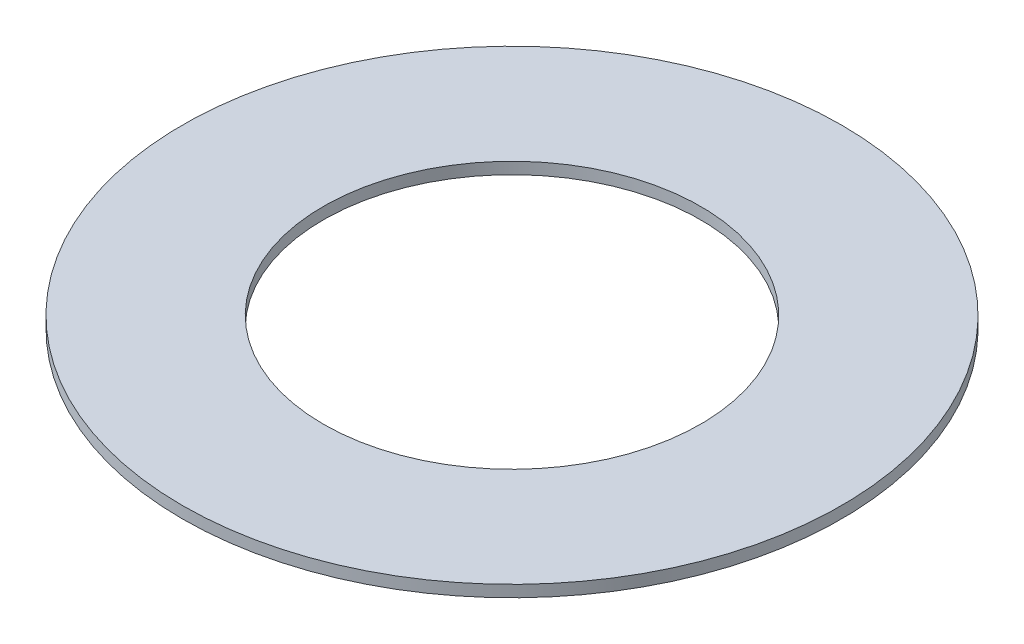
ISO-10303-21;
HEADER;
FILE_DESCRIPTION(('STEP AP214'),'2;1');
FILE_NAME('part.step','',(''),(''),'','','');
FILE_SCHEMA(('AUTOMOTIVE_DESIGN { 1 0 10303 214 1 1 1 1 }'));
ENDSEC;
DATA;
#1=APPLICATION_CONTEXT('core data for automotive mechanical design processes');
#2=APPLICATION_PROTOCOL_DEFINITION('international standard','automotive_design',2000,#1);
#3=PRODUCT_CONTEXT('',#1,'mechanical');
#4=PRODUCT('Part','Part','',(#3));
#5=PRODUCT_RELATED_PRODUCT_CATEGORY('part','',(#4));
#6=PRODUCT_DEFINITION_FORMATION('','',#4);
#7=PRODUCT_DEFINITION_CONTEXT('part definition',#1,'design');
#8=PRODUCT_DEFINITION('design','',#6,#7);
#9=PRODUCT_DEFINITION_SHAPE('','',#8);
#10=(LENGTH_UNIT() NAMED_UNIT(*) SI_UNIT(.MILLI.,.METRE.));
#11=(NAMED_UNIT(*) PLANE_ANGLE_UNIT() SI_UNIT($,.RADIAN.));
#12=(NAMED_UNIT(*) SI_UNIT($,.STERADIAN.) SOLID_ANGLE_UNIT());
#13=UNCERTAINTY_MEASURE_WITH_UNIT(LENGTH_MEASURE(1.E-05),#10,'distance_accuracy_value','');
#14=(GEOMETRIC_REPRESENTATION_CONTEXT(3) GLOBAL_UNCERTAINTY_ASSIGNED_CONTEXT((#13)) GLOBAL_UNIT_ASSIGNED_CONTEXT((#10,
#11,#12)) REPRESENTATION_CONTEXT('',''));
#15=CARTESIAN_POINT('',(0.,0.,0.));
#16=DIRECTION('',(0.,0.,1.));
#17=DIRECTION('',(1.,0.,0.));
#18=AXIS2_PLACEMENT_3D('',#15,#16,#17);
#19=CARTESIAN_POINT('',(0.,0.5,0.));
#20=DIRECTION('',(0.,1.,0.));
#21=DIRECTION('',(0.,0.,1.));
#22=AXIS2_PLACEMENT_3D('',#19,#20,#21);
#23=PLANE('',#22);
#24=CARTESIAN_POINT('',(0.,0.5,0.));
#25=DIRECTION('',(0.,1.,0.));
#26=DIRECTION('',(0.,0.,1.));
#27=AXIS2_PLACEMENT_3D('',#24,#25,#26);
#28=CIRCLE('',#27,14.15);
#29=CARTESIAN_POINT('',(0.,0.5,14.15));
#30=VERTEX_POINT('',#29);
#31=EDGE_CURVE('E10',#30,#30,#28,.T.);
#32=ORIENTED_EDGE('',*,*,#31,.T.);
#33=EDGE_LOOP('',(#32));
#34=FACE_BOUND('',#33,.T.);
#35=CARTESIAN_POINT('',(0.,0.5,0.));
#36=DIRECTION('',(0.,1.,0.));
#37=DIRECTION('',(0.,0.,1.));
#38=AXIS2_PLACEMENT_3D('',#35,#36,#37);
#39=CIRCLE('',#38,8.1);
#40=CARTESIAN_POINT('',(0.,0.5,8.1));
#41=VERTEX_POINT('',#40);
#42=EDGE_CURVE('E42',#41,#41,#39,.T.);
#43=ORIENTED_EDGE('',*,*,#42,.F.);
#44=EDGE_LOOP('',(#43));
#45=FACE_BOUND('',#44,.T.);
#46=ADVANCED_FACE('F31',(#34,#45),#23,.T.);
#47=CARTESIAN_POINT('',(0.,0.,0.));
#48=DIRECTION('',(0.,1.,0.));
#49=DIRECTION('',(0.,0.,1.));
#50=AXIS2_PLACEMENT_3D('',#47,#48,#49);
#51=PLANE('',#50);
#52=CARTESIAN_POINT('',(0.,0.,0.));
#53=DIRECTION('',(0.,1.,0.));
#54=DIRECTION('',(0.,0.,1.));
#55=AXIS2_PLACEMENT_3D('',#52,#53,#54);
#56=CIRCLE('',#55,14.15);
#57=CARTESIAN_POINT('',(0.,0.,14.15));
#58=VERTEX_POINT('',#57);
#59=EDGE_CURVE('E35',#58,#58,#56,.T.);
#60=ORIENTED_EDGE('',*,*,#59,.F.);
#61=EDGE_LOOP('',(#60));
#62=FACE_BOUND('',#61,.T.);
#63=CARTESIAN_POINT('',(0.,0.,0.));
#64=DIRECTION('',(0.,1.,0.));
#65=DIRECTION('',(0.,0.,1.));
#66=AXIS2_PLACEMENT_3D('',#63,#64,#65);
#67=CIRCLE('',#66,8.1);
#68=CARTESIAN_POINT('',(0.,0.,8.1));
#69=VERTEX_POINT('',#68);
#70=EDGE_CURVE('E44',#69,#69,#67,.T.);
#71=ORIENTED_EDGE('',*,*,#70,.T.);
#72=EDGE_LOOP('',(#71));
#73=FACE_BOUND('',#72,.T.);
#74=ADVANCED_FACE('F54',(#62,#73),#51,.F.);
#75=CARTESIAN_POINT('',(0.,0.5,0.));
#76=DIRECTION('',(0.,-1.,0.));
#77=DIRECTION('',(0.,0.,-1.));
#78=AXIS2_PLACEMENT_3D('',#75,#76,#77);
#79=CYLINDRICAL_SURFACE('',#78,14.15);
#80=ORIENTED_EDGE('',*,*,#31,.F.);
#81=EDGE_LOOP('',(#80));
#82=FACE_BOUND('',#81,.T.);
#83=ORIENTED_EDGE('',*,*,#59,.T.);
#84=EDGE_LOOP('',(#83));
#85=FACE_BOUND('',#84,.T.);
#86=ADVANCED_FACE('F33',(#82,#85),#79,.T.);
#87=CARTESIAN_POINT('',(0.,0.5,0.));
#88=DIRECTION('',(0.,-1.,0.));
#89=DIRECTION('',(0.,0.,-1.));
#90=AXIS2_PLACEMENT_3D('',#87,#88,#89);
#91=CYLINDRICAL_SURFACE('',#90,8.1);
#92=ORIENTED_EDGE('',*,*,#42,.T.);
#93=EDGE_LOOP('',(#92));
#94=FACE_BOUND('',#93,.T.);
#95=ORIENTED_EDGE('',*,*,#70,.F.);
#96=EDGE_LOOP('',(#95));
#97=FACE_BOUND('',#96,.T.);
#98=ADVANCED_FACE('F50',(#94,#97),#91,.F.);
#99=CLOSED_SHELL('',(#46,#74,#86,#98));
#100=MANIFOLD_SOLID_BREP('B2',#99);
#101=ADVANCED_BREP_SHAPE_REPRESENTATION('',(#18,#100),#14);
#102=SHAPE_DEFINITION_REPRESENTATION(#9,#101);
ENDSEC;
END-ISO-10303-21;
